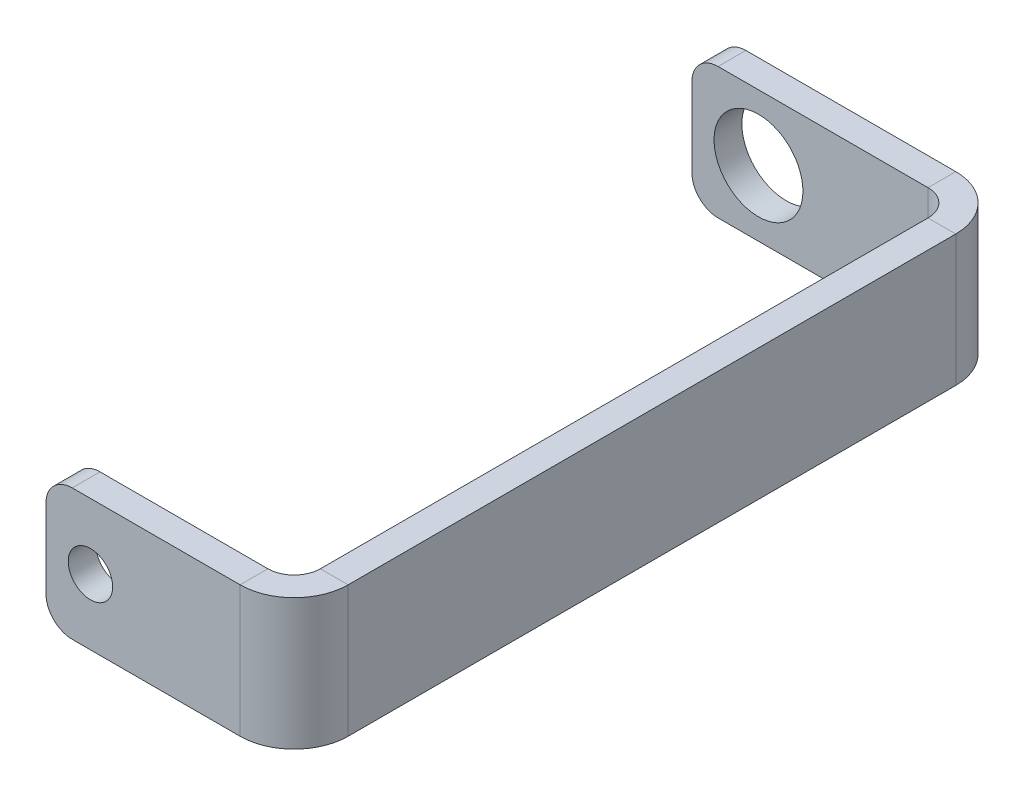
ISO-10303-21;
HEADER;
FILE_DESCRIPTION(('STEP AP214'),'2;1');
FILE_NAME('part.step','',(''),(''),'','','');
FILE_SCHEMA(('AUTOMOTIVE_DESIGN { 1 0 10303 214 1 1 1 1 }'));
ENDSEC;
DATA;
#1=APPLICATION_CONTEXT('core data for automotive mechanical design processes');
#2=APPLICATION_PROTOCOL_DEFINITION('international standard','automotive_design',2000,#1);
#3=PRODUCT_CONTEXT('',#1,'mechanical');
#4=PRODUCT('Part','Part','',(#3));
#5=PRODUCT_RELATED_PRODUCT_CATEGORY('part','',(#4));
#6=PRODUCT_DEFINITION_FORMATION('','',#4);
#7=PRODUCT_DEFINITION_CONTEXT('part definition',#1,'design');
#8=PRODUCT_DEFINITION('design','',#6,#7);
#9=PRODUCT_DEFINITION_SHAPE('','',#8);
#10=(LENGTH_UNIT() NAMED_UNIT(*) SI_UNIT(.MILLI.,.METRE.));
#11=(NAMED_UNIT(*) PLANE_ANGLE_UNIT() SI_UNIT($,.RADIAN.));
#12=(NAMED_UNIT(*) SI_UNIT($,.STERADIAN.) SOLID_ANGLE_UNIT());
#13=UNCERTAINTY_MEASURE_WITH_UNIT(LENGTH_MEASURE(1.E-05),#10,'distance_accuracy_value','');
#14=(GEOMETRIC_REPRESENTATION_CONTEXT(3) GLOBAL_UNCERTAINTY_ASSIGNED_CONTEXT((#13)) GLOBAL_UNIT_ASSIGNED_CONTEXT((#10,
#11,#12)) REPRESENTATION_CONTEXT('',''));
#15=CARTESIAN_POINT('',(0.,0.,0.));
#16=DIRECTION('',(0.,0.,1.));
#17=DIRECTION('',(1.,0.,0.));
#18=AXIS2_PLACEMENT_3D('',#15,#16,#17);
#19=CARTESIAN_POINT('',(18.175,7.5,0.));
#20=DIRECTION('',(0.,1.,0.));
#21=DIRECTION('',(0.,0.,1.));
#22=AXIS2_PLACEMENT_3D('',#19,#20,#21);
#23=PLANE('',#22);
#24=DIRECTION('',(0.,0.,-1.));
#25=VECTOR('',#24,1.);
#26=CARTESIAN_POINT('',(15.,7.5,0.));
#27=LINE('',#26,#25);
#28=CARTESIAN_POINT('',(15.0000000000003,7.5,72.477));
#29=VERTEX_POINT('',#28);
#30=CARTESIAN_POINT('',(15.,7.5,2.99999999999999));
#31=VERTEX_POINT('',#30);
#32=EDGE_CURVE('E236',#29,#31,#27,.T.);
#33=ORIENTED_EDGE('',*,*,#32,.F.);
#34=DIRECTION('',(1.,0.,0.));
#35=VECTOR('',#34,1.);
#36=CARTESIAN_POINT('',(15.0000000000003,7.5,72.477));
#37=LINE('',#36,#35);
#38=CARTESIAN_POINT('',(18.1750000000003,7.5,72.477));
#39=VERTEX_POINT('',#38);
#40=EDGE_CURVE('E208',#29,#39,#37,.T.);
#41=ORIENTED_EDGE('',*,*,#40,.T.);
#42=DIRECTION('',(0.,0.,-1.));
#43=VECTOR('',#42,1.);
#44=CARTESIAN_POINT('',(18.175,7.5,0.));
#45=LINE('',#44,#43);
#46=CARTESIAN_POINT('',(18.175,7.5,2.99999999999998));
#47=VERTEX_POINT('',#46);
#48=EDGE_CURVE('E235',#39,#47,#45,.T.);
#49=ORIENTED_EDGE('',*,*,#48,.T.);
#50=DIRECTION('',(1.,0.,0.));
#51=VECTOR('',#50,1.);
#52=CARTESIAN_POINT('',(15.,7.5,2.99999999999999));
#53=LINE('',#52,#51);
#54=EDGE_CURVE('E223',#31,#47,#53,.T.);
#55=ORIENTED_EDGE('',*,*,#54,.F.);
#56=EDGE_LOOP('',(#33,#41,#49,#55));
#57=FACE_BOUND('',#56,.T.);
#58=ADVANCED_FACE('F43',(#57),#23,.T.);
#59=CARTESIAN_POINT('',(18.175,0.,0.));
#60=DIRECTION('',(1.,0.,0.));
#61=DIRECTION('',(0.,0.,-1.));
#62=AXIS2_PLACEMENT_3D('',#59,#60,#61);
#63=PLANE('',#62);
#64=ORIENTED_EDGE('',*,*,#48,.F.);
#65=DIRECTION('',(0.,1.,0.));
#66=VECTOR('',#65,1.);
#67=CARTESIAN_POINT('',(18.1750000000003,7.5,72.477));
#68=LINE('',#67,#66);
#69=CARTESIAN_POINT('',(18.1750000000003,-7.5,72.477));
#70=VERTEX_POINT('',#69);
#71=EDGE_CURVE('E177',#39,#70,#68,.F.);
#72=ORIENTED_EDGE('',*,*,#71,.T.);
#73=DIRECTION('',(0.,0.,1.));
#74=VECTOR('',#73,1.);
#75=CARTESIAN_POINT('',(18.1750000000003,-7.5,75.477));
#76=LINE('',#75,#74);
#77=CARTESIAN_POINT('',(18.175,-7.5,2.99999999999998));
#78=VERTEX_POINT('',#77);
#79=EDGE_CURVE('E232',#78,#70,#76,.T.);
#80=ORIENTED_EDGE('',*,*,#79,.F.);
#81=DIRECTION('',(0.,1.,0.));
#82=VECTOR('',#81,1.);
#83=CARTESIAN_POINT('',(18.175,0.,2.99999999999998));
#84=LINE('',#83,#82);
#85=EDGE_CURVE('E226',#78,#47,#84,.T.);
#86=ORIENTED_EDGE('',*,*,#85,.T.);
#87=EDGE_LOOP('',(#64,#72,#80,#86));
#88=FACE_BOUND('',#87,.T.);
#89=ADVANCED_FACE('F350',(#88),#63,.T.);
#90=CARTESIAN_POINT('',(15.,0.,0.));
#91=DIRECTION('',(1.,0.,0.));
#92=DIRECTION('',(0.,0.,-1.));
#93=AXIS2_PLACEMENT_3D('',#90,#91,#92);
#94=PLANE('',#93);
#95=DIRECTION('',(0.,1.,0.));
#96=VECTOR('',#95,1.);
#97=CARTESIAN_POINT('',(15.0000000000003,7.5,72.477));
#98=LINE('',#97,#96);
#99=CARTESIAN_POINT('',(15.0000000000003,-7.5,72.477));
#100=VERTEX_POINT('',#99);
#101=EDGE_CURVE('E212',#29,#100,#98,.F.);
#102=ORIENTED_EDGE('',*,*,#101,.F.);
#103=ORIENTED_EDGE('',*,*,#32,.T.);
#104=DIRECTION('',(0.,1.,0.));
#105=VECTOR('',#104,1.);
#106=CARTESIAN_POINT('',(15.,-7.5,2.99999999999999));
#107=LINE('',#106,#105);
#108=CARTESIAN_POINT('',(15.,-7.5,2.99999999999999));
#109=VERTEX_POINT('',#108);
#110=EDGE_CURVE('E220',#109,#31,#107,.T.);
#111=ORIENTED_EDGE('',*,*,#110,.F.);
#112=DIRECTION('',(0.,0.,1.));
#113=VECTOR('',#112,1.);
#114=CARTESIAN_POINT('',(15.0000000000003,-7.5,75.477));
#115=LINE('',#114,#113);
#116=EDGE_CURVE('E231',#109,#100,#115,.T.);
#117=ORIENTED_EDGE('',*,*,#116,.T.);
#118=EDGE_LOOP('',(#102,#103,#111,#117));
#119=FACE_BOUND('',#118,.T.);
#120=ADVANCED_FACE('F360',(#119),#94,.F.);
#121=CARTESIAN_POINT('',(-15.,7.5,-3.175));
#122=DIRECTION('',(0.,1.,0.));
#123=DIRECTION('',(0.,0.,1.));
#124=AXIS2_PLACEMENT_3D('',#121,#122,#123);
#125=PLANE('',#124);
#126=DIRECTION('',(-1.,0.,0.));
#127=VECTOR('',#126,1.);
#128=CARTESIAN_POINT('',(-15.,7.5,-3.175));
#129=LINE('',#128,#127);
#130=CARTESIAN_POINT('',(12.,7.5,-3.175));
#131=VERTEX_POINT('',#130);
#132=CARTESIAN_POINT('',(-12.,7.5,-3.175));
#133=VERTEX_POINT('',#132);
#134=EDGE_CURVE('E266',#131,#133,#129,.T.);
#135=ORIENTED_EDGE('',*,*,#134,.T.);
#136=DIRECTION('',(0.,0.,1.));
#137=VECTOR('',#136,1.);
#138=CARTESIAN_POINT('',(-12.,7.5,-3.175));
#139=LINE('',#138,#137);
#140=CARTESIAN_POINT('',(-12.,7.5,0.));
#141=VERTEX_POINT('',#140);
#142=EDGE_CURVE('E302',#133,#141,#139,.T.);
#143=ORIENTED_EDGE('',*,*,#142,.T.);
#144=DIRECTION('',(-1.,0.,0.));
#145=VECTOR('',#144,1.);
#146=CARTESIAN_POINT('',(-15.,7.5,0.));
#147=LINE('',#146,#145);
#148=CARTESIAN_POINT('',(12.,7.5,0.));
#149=VERTEX_POINT('',#148);
#150=EDGE_CURVE('E263',#149,#141,#147,.T.);
#151=ORIENTED_EDGE('',*,*,#150,.F.);
#152=DIRECTION('',(0.,0.,-1.));
#153=VECTOR('',#152,1.);
#154=CARTESIAN_POINT('',(12.,7.5,0.));
#155=LINE('',#154,#153);
#156=EDGE_CURVE('E249',#149,#131,#155,.T.);
#157=ORIENTED_EDGE('',*,*,#156,.T.);
#158=EDGE_LOOP('',(#135,#143,#151,#157));
#159=FACE_BOUND('',#158,.T.);
#160=ADVANCED_FACE('F321',(#159),#125,.T.);
#161=CARTESIAN_POINT('',(0.,0.,-3.175));
#162=DIRECTION('',(0.,0.,-1.));
#163=DIRECTION('',(-1.,0.,0.));
#164=AXIS2_PLACEMENT_3D('',#161,#162,#163);
#165=PLANE('',#164);
#166=CARTESIAN_POINT('',(-7.38,0.,-3.175));
#167=DIRECTION('',(0.,0.,1.));
#168=DIRECTION('',(1.,0.,0.));
#169=AXIS2_PLACEMENT_3D('',#166,#167,#168);
#170=CIRCLE('',#169,5.08);
#171=CARTESIAN_POINT('',(-2.3,0.,-3.175));
#172=VERTEX_POINT('',#171);
#173=EDGE_CURVE('E370',#172,#172,#170,.T.);
#174=ORIENTED_EDGE('',*,*,#173,.T.);
#175=EDGE_LOOP('',(#174));
#176=FACE_BOUND('',#175,.T.);
#177=DIRECTION('',(0.,-1.,0.));
#178=VECTOR('',#177,1.);
#179=CARTESIAN_POINT('',(-15.,-7.5,-3.175));
#180=LINE('',#179,#178);
#181=CARTESIAN_POINT('',(-15.,4.5,-3.175));
#182=VERTEX_POINT('',#181);
#183=CARTESIAN_POINT('',(-15.,-4.5,-3.175));
#184=VERTEX_POINT('',#183);
#185=EDGE_CURVE('E269',#182,#184,#180,.T.);
#186=ORIENTED_EDGE('',*,*,#185,.F.);
#187=CARTESIAN_POINT('',(-12.,4.5,-3.175));
#188=DIRECTION('',(0.,0.,-1.));
#189=DIRECTION('',(-1.,0.,0.));
#190=AXIS2_PLACEMENT_3D('',#187,#188,#189);
#191=CIRCLE('',#190,3.);
#192=EDGE_CURVE('E51',#182,#133,#191,.T.);
#193=ORIENTED_EDGE('',*,*,#192,.T.);
#194=ORIENTED_EDGE('',*,*,#134,.F.);
#195=DIRECTION('',(0.,1.,0.));
#196=VECTOR('',#195,1.);
#197=CARTESIAN_POINT('',(12.,7.5,-3.175));
#198=LINE('',#197,#196);
#199=CARTESIAN_POINT('',(12.,-7.5,-3.175));
#200=VERTEX_POINT('',#199);
#201=EDGE_CURVE('E242',#131,#200,#198,.F.);
#202=ORIENTED_EDGE('',*,*,#201,.T.);
#203=DIRECTION('',(1.,0.,0.));
#204=VECTOR('',#203,1.);
#205=CARTESIAN_POINT('',(-15.,-7.5,-3.175));
#206=LINE('',#205,#204);
#207=CARTESIAN_POINT('',(-12.,-7.5,-3.175));
#208=VERTEX_POINT('',#207);
#209=EDGE_CURVE('E272',#208,#200,#206,.T.);
#210=ORIENTED_EDGE('',*,*,#209,.F.);
#211=CARTESIAN_POINT('',(-12.,-4.5,-3.175));
#212=DIRECTION('',(0.,0.,-1.));
#213=DIRECTION('',(-1.,0.,0.));
#214=AXIS2_PLACEMENT_3D('',#211,#212,#213);
#215=CIRCLE('',#214,3.);
#216=EDGE_CURVE('E63',#208,#184,#215,.T.);
#217=ORIENTED_EDGE('',*,*,#216,.T.);
#218=EDGE_LOOP('',(#186,#193,#194,#202,#210,#217));
#219=FACE_BOUND('',#218,.T.);
#220=ADVANCED_FACE('F316',(#176,#219),#165,.T.);
#221=CARTESIAN_POINT('',(0.,0.,0.));
#222=DIRECTION('',(0.,0.,-1.));
#223=DIRECTION('',(-1.,0.,0.));
#224=AXIS2_PLACEMENT_3D('',#221,#222,#223);
#225=PLANE('',#224);
#226=CARTESIAN_POINT('',(-7.38,0.,0.));
#227=DIRECTION('',(0.,0.,1.));
#228=DIRECTION('',(1.,0.,0.));
#229=AXIS2_PLACEMENT_3D('',#226,#227,#228);
#230=CIRCLE('',#229,5.08);
#231=CARTESIAN_POINT('',(-2.3,0.,0.));
#232=VERTEX_POINT('',#231);
#233=EDGE_CURVE('E284',#232,#232,#230,.T.);
#234=ORIENTED_EDGE('',*,*,#233,.F.);
#235=EDGE_LOOP('',(#234));
#236=FACE_BOUND('',#235,.T.);
#237=ORIENTED_EDGE('',*,*,#150,.T.);
#238=CARTESIAN_POINT('',(-12.,4.5,0.));
#239=DIRECTION('',(0.,0.,-1.));
#240=DIRECTION('',(-1.,0.,0.));
#241=AXIS2_PLACEMENT_3D('',#238,#239,#240);
#242=CIRCLE('',#241,3.);
#243=CARTESIAN_POINT('',(-15.,4.5,0.));
#244=VERTEX_POINT('',#243);
#245=EDGE_CURVE('E307',#141,#244,#242,.F.);
#246=ORIENTED_EDGE('',*,*,#245,.T.);
#247=DIRECTION('',(0.,-1.,0.));
#248=VECTOR('',#247,1.);
#249=CARTESIAN_POINT('',(-15.,-7.5,0.));
#250=LINE('',#249,#248);
#251=CARTESIAN_POINT('',(-15.,-4.5,0.));
#252=VERTEX_POINT('',#251);
#253=EDGE_CURVE('E277',#244,#252,#250,.T.);
#254=ORIENTED_EDGE('',*,*,#253,.T.);
#255=CARTESIAN_POINT('',(-12.,-4.5,0.));
#256=DIRECTION('',(0.,0.,-1.));
#257=DIRECTION('',(-1.,0.,0.));
#258=AXIS2_PLACEMENT_3D('',#255,#256,#257);
#259=CIRCLE('',#258,3.);
#260=CARTESIAN_POINT('',(-12.,-7.5,0.));
#261=VERTEX_POINT('',#260);
#262=EDGE_CURVE('E305',#252,#261,#259,.F.);
#263=ORIENTED_EDGE('',*,*,#262,.T.);
#264=DIRECTION('',(1.,0.,0.));
#265=VECTOR('',#264,1.);
#266=CARTESIAN_POINT('',(-15.,-7.5,0.));
#267=LINE('',#266,#265);
#268=CARTESIAN_POINT('',(12.,-7.5,0.));
#269=VERTEX_POINT('',#268);
#270=EDGE_CURVE('E270',#261,#269,#267,.T.);
#271=ORIENTED_EDGE('',*,*,#270,.T.);
#272=DIRECTION('',(0.,1.,0.));
#273=VECTOR('',#272,1.);
#274=CARTESIAN_POINT('',(12.,7.5,0.));
#275=LINE('',#274,#273);
#276=EDGE_CURVE('E255',#149,#269,#275,.F.);
#277=ORIENTED_EDGE('',*,*,#276,.F.);
#278=EDGE_LOOP('',(#237,#246,#254,#263,#271,#277));
#279=FACE_BOUND('',#278,.T.);
#280=ADVANCED_FACE('F326',(#236,#279),#225,.F.);
#281=CARTESIAN_POINT('',(-15.,-7.5,-3.175));
#282=DIRECTION('',(0.,-1.,0.));
#283=DIRECTION('',(0.,0.,-1.));
#284=AXIS2_PLACEMENT_3D('',#281,#282,#283);
#285=PLANE('',#284);
#286=ORIENTED_EDGE('',*,*,#270,.F.);
#287=DIRECTION('',(0.,0.,1.));
#288=VECTOR('',#287,1.);
#289=CARTESIAN_POINT('',(-12.,-7.5,-3.175));
#290=LINE('',#289,#288);
#291=EDGE_CURVE('E11',#261,#208,#290,.F.);
#292=ORIENTED_EDGE('',*,*,#291,.T.);
#293=ORIENTED_EDGE('',*,*,#209,.T.);
#294=DIRECTION('',(0.,0.,-1.));
#295=VECTOR('',#294,1.);
#296=CARTESIAN_POINT('',(12.,-7.5,0.));
#297=LINE('',#296,#295);
#298=EDGE_CURVE('E260',#269,#200,#297,.T.);
#299=ORIENTED_EDGE('',*,*,#298,.F.);
#300=EDGE_LOOP('',(#286,#292,#293,#299));
#301=FACE_BOUND('',#300,.T.);
#302=ADVANCED_FACE('F333',(#301),#285,.T.);
#303=CARTESIAN_POINT('',(-15.,-7.5,-3.175));
#304=DIRECTION('',(-1.,0.,0.));
#305=DIRECTION('',(0.,0.,1.));
#306=AXIS2_PLACEMENT_3D('',#303,#304,#305);
#307=PLANE('',#306);
#308=ORIENTED_EDGE('',*,*,#253,.F.);
#309=DIRECTION('',(0.,0.,1.));
#310=VECTOR('',#309,1.);
#311=CARTESIAN_POINT('',(-15.,4.5,-3.175));
#312=LINE('',#311,#310);
#313=EDGE_CURVE('E312',#244,#182,#312,.F.);
#314=ORIENTED_EDGE('',*,*,#313,.T.);
#315=ORIENTED_EDGE('',*,*,#185,.T.);
#316=DIRECTION('',(0.,0.,1.));
#317=VECTOR('',#316,1.);
#318=CARTESIAN_POINT('',(-15.,-4.5,-3.175));
#319=LINE('',#318,#317);
#320=EDGE_CURVE('E309',#184,#252,#319,.T.);
#321=ORIENTED_EDGE('',*,*,#320,.T.);
#322=EDGE_LOOP('',(#308,#314,#315,#321));
#323=FACE_BOUND('',#322,.T.);
#324=ADVANCED_FACE('F329',(#323),#307,.T.);
#325=CARTESIAN_POINT('',(12.,-7.5,3.));
#326=DIRECTION('',(0.,-1.,0.));
#327=DIRECTION('',(0.,0.,-1.));
#328=AXIS2_PLACEMENT_3D('',#325,#326,#327);
#329=PLANE('',#328);
#330=DIRECTION('',(1.,0.,0.));
#331=VECTOR('',#330,1.);
#332=CARTESIAN_POINT('',(15.,-7.5,2.99999999999999));
#333=LINE('',#332,#331);
#334=EDGE_CURVE('E218',#109,#78,#333,.T.);
#335=ORIENTED_EDGE('',*,*,#334,.F.);
#336=CARTESIAN_POINT('',(12.,-7.5,3.));
#337=DIRECTION('',(0.,1.,0.));
#338=DIRECTION('',(0.,0.,1.));
#339=AXIS2_PLACEMENT_3D('',#336,#337,#338);
#340=CIRCLE('',#339,3.);
#341=EDGE_CURVE('E252',#269,#109,#340,.F.);
#342=ORIENTED_EDGE('',*,*,#341,.F.);
#343=ORIENTED_EDGE('',*,*,#298,.T.);
#344=CARTESIAN_POINT('',(12.,-7.5,3.));
#345=DIRECTION('',(0.,1.,0.));
#346=DIRECTION('',(0.,0.,1.));
#347=AXIS2_PLACEMENT_3D('',#344,#345,#346);
#348=CIRCLE('',#347,6.175);
#349=EDGE_CURVE('E245',#200,#78,#348,.F.);
#350=ORIENTED_EDGE('',*,*,#349,.T.);
#351=EDGE_LOOP('',(#335,#342,#343,#350));
#352=FACE_BOUND('',#351,.T.);
#353=ADVANCED_FACE('F337',(#352),#329,.T.);
#354=CARTESIAN_POINT('',(12.,7.5,3.));
#355=DIRECTION('',(0.,-1.,0.));
#356=DIRECTION('',(0.,0.,-1.));
#357=AXIS2_PLACEMENT_3D('',#354,#355,#356);
#358=PLANE('',#357);
#359=CARTESIAN_POINT('',(12.,7.5,3.));
#360=DIRECTION('',(0.,1.,0.));
#361=DIRECTION('',(0.,0.,1.));
#362=AXIS2_PLACEMENT_3D('',#359,#360,#361);
#363=CIRCLE('',#362,3.);
#364=EDGE_CURVE('E238',#31,#149,#363,.T.);
#365=ORIENTED_EDGE('',*,*,#364,.F.);
#366=ORIENTED_EDGE('',*,*,#54,.T.);
#367=CARTESIAN_POINT('',(12.,7.5,3.));
#368=DIRECTION('',(0.,1.,0.));
#369=DIRECTION('',(0.,0.,1.));
#370=AXIS2_PLACEMENT_3D('',#367,#368,#369);
#371=CIRCLE('',#370,6.175);
#372=EDGE_CURVE('E246',#47,#131,#371,.T.);
#373=ORIENTED_EDGE('',*,*,#372,.T.);
#374=ORIENTED_EDGE('',*,*,#156,.F.);
#375=EDGE_LOOP('',(#365,#366,#373,#374));
#376=FACE_BOUND('',#375,.T.);
#377=ADVANCED_FACE('F343',(#376),#358,.F.);
#378=CARTESIAN_POINT('',(12.,7.5,3.));
#379=DIRECTION('',(0.,1.,0.));
#380=DIRECTION('',(1.,0.,0.));
#381=AXIS2_PLACEMENT_3D('',#378,#379,#380);
#382=CYLINDRICAL_SURFACE('',#381,6.175);
#383=ORIENTED_EDGE('',*,*,#201,.F.);
#384=ORIENTED_EDGE('',*,*,#372,.F.);
#385=ORIENTED_EDGE('',*,*,#85,.F.);
#386=ORIENTED_EDGE('',*,*,#349,.F.);
#387=EDGE_LOOP('',(#383,#384,#385,#386));
#388=FACE_BOUND('',#387,.T.);
#389=ADVANCED_FACE('F340',(#388),#382,.T.);
#390=CARTESIAN_POINT('',(12.,7.5,3.));
#391=DIRECTION('',(0.,1.,0.));
#392=DIRECTION('',(1.,0.,0.));
#393=AXIS2_PLACEMENT_3D('',#390,#391,#392);
#394=CYLINDRICAL_SURFACE('',#393,3.);
#395=ORIENTED_EDGE('',*,*,#276,.T.);
#396=ORIENTED_EDGE('',*,*,#341,.T.);
#397=ORIENTED_EDGE('',*,*,#110,.T.);
#398=ORIENTED_EDGE('',*,*,#364,.T.);
#399=EDGE_LOOP('',(#395,#396,#397,#398));
#400=FACE_BOUND('',#399,.T.);
#401=ADVANCED_FACE('F357',(#400),#394,.F.);
#402=CARTESIAN_POINT('',(18.1750000000003,-7.5,75.477));
#403=DIRECTION('',(0.,-1.,0.));
#404=DIRECTION('',(0.,0.,-1.));
#405=AXIS2_PLACEMENT_3D('',#402,#403,#404);
#406=PLANE('',#405);
#407=DIRECTION('',(1.,0.,0.));
#408=VECTOR('',#407,1.);
#409=CARTESIAN_POINT('',(15.0000000000003,-7.5,72.477));
#410=LINE('',#409,#408);
#411=EDGE_CURVE('E215',#100,#70,#410,.T.);
#412=ORIENTED_EDGE('',*,*,#411,.F.);
#413=ORIENTED_EDGE('',*,*,#116,.F.);
#414=ORIENTED_EDGE('',*,*,#334,.T.);
#415=ORIENTED_EDGE('',*,*,#79,.T.);
#416=EDGE_LOOP('',(#412,#413,#414,#415));
#417=FACE_BOUND('',#416,.T.);
#418=ADVANCED_FACE('F353',(#417),#406,.T.);
#419=CARTESIAN_POINT('',(12.0000000000003,-7.5,72.477));
#420=DIRECTION('',(0.,-1.,0.));
#421=DIRECTION('',(0.,0.,-1.));
#422=AXIS2_PLACEMENT_3D('',#419,#420,#421);
#423=PLANE('',#422);
#424=DIRECTION('',(0.,0.,1.));
#425=VECTOR('',#424,1.);
#426=CARTESIAN_POINT('',(12.0000000000003,-7.5,75.477));
#427=LINE('',#426,#425);
#428=CARTESIAN_POINT('',(12.0000000000003,-7.5,75.477));
#429=VERTEX_POINT('',#428);
#430=CARTESIAN_POINT('',(12.0000000000003,-7.49999999999999,78.652));
#431=VERTEX_POINT('',#430);
#432=EDGE_CURVE('E198',#429,#431,#427,.T.);
#433=ORIENTED_EDGE('',*,*,#432,.F.);
#434=CARTESIAN_POINT('',(12.0000000000003,-7.5,72.477));
#435=DIRECTION('',(0.,1.,0.));
#436=DIRECTION('',(0.,0.,1.));
#437=AXIS2_PLACEMENT_3D('',#434,#435,#436);
#438=CIRCLE('',#437,3.);
#439=EDGE_CURVE('E180',#100,#429,#438,.F.);
#440=ORIENTED_EDGE('',*,*,#439,.F.);
#441=ORIENTED_EDGE('',*,*,#411,.T.);
#442=CARTESIAN_POINT('',(12.0000000000003,-7.49999999999999,72.477));
#443=DIRECTION('',(0.,1.,0.));
#444=DIRECTION('',(0.,0.,1.));
#445=AXIS2_PLACEMENT_3D('',#442,#443,#444);
#446=CIRCLE('',#445,6.175);
#447=EDGE_CURVE('E207',#70,#431,#446,.F.);
#448=ORIENTED_EDGE('',*,*,#447,.T.);
#449=EDGE_LOOP('',(#433,#440,#441,#448));
#450=FACE_BOUND('',#449,.T.);
#451=ADVANCED_FACE('F406',(#450),#423,.T.);
#452=CARTESIAN_POINT('',(12.0000000000003,7.5,72.477));
#453=DIRECTION('',(0.,-1.,0.));
#454=DIRECTION('',(0.,0.,-1.));
#455=AXIS2_PLACEMENT_3D('',#452,#453,#454);
#456=PLANE('',#455);
#457=CARTESIAN_POINT('',(12.0000000000003,7.5,72.477));
#458=DIRECTION('',(0.,1.,0.));
#459=DIRECTION('',(0.,0.,1.));
#460=AXIS2_PLACEMENT_3D('',#457,#458,#459);
#461=CIRCLE('',#460,3.);
#462=CARTESIAN_POINT('',(12.0000000000003,7.5,75.477));
#463=VERTEX_POINT('',#462);
#464=EDGE_CURVE('E167',#463,#29,#461,.T.);
#465=ORIENTED_EDGE('',*,*,#464,.F.);
#466=DIRECTION('',(0.,0.,1.));
#467=VECTOR('',#466,1.);
#468=CARTESIAN_POINT('',(12.0000000000003,7.5,75.477));
#469=LINE('',#468,#467);
#470=CARTESIAN_POINT('',(12.0000000000003,7.5,78.652));
#471=VERTEX_POINT('',#470);
#472=EDGE_CURVE('E161',#463,#471,#469,.T.);
#473=ORIENTED_EDGE('',*,*,#472,.T.);
#474=CARTESIAN_POINT('',(12.0000000000003,7.5,72.477));
#475=DIRECTION('',(0.,1.,0.));
#476=DIRECTION('',(0.,0.,1.));
#477=AXIS2_PLACEMENT_3D('',#474,#475,#476);
#478=CIRCLE('',#477,6.175);
#479=EDGE_CURVE('E172',#471,#39,#478,.T.);
#480=ORIENTED_EDGE('',*,*,#479,.T.);
#481=ORIENTED_EDGE('',*,*,#40,.F.);
#482=EDGE_LOOP('',(#465,#473,#480,#481));
#483=FACE_BOUND('',#482,.T.);
#484=ADVANCED_FACE('F183',(#483),#456,.F.);
#485=CARTESIAN_POINT('',(12.0000000000003,7.5,72.477));
#486=DIRECTION('',(0.,1.,0.));
#487=DIRECTION('',(0.,0.,1.));
#488=AXIS2_PLACEMENT_3D('',#485,#486,#487);
#489=CYLINDRICAL_SURFACE('',#488,6.175);
#490=ORIENTED_EDGE('',*,*,#71,.F.);
#491=ORIENTED_EDGE('',*,*,#479,.F.);
#492=DIRECTION('',(0.,1.,0.));
#493=VECTOR('',#492,1.);
#494=CARTESIAN_POINT('',(12.0000000000003,0.,78.652));
#495=LINE('',#494,#493);
#496=EDGE_CURVE('E174',#431,#471,#495,.T.);
#497=ORIENTED_EDGE('',*,*,#496,.F.);
#498=ORIENTED_EDGE('',*,*,#447,.F.);
#499=EDGE_LOOP('',(#490,#491,#497,#498));
#500=FACE_BOUND('',#499,.T.);
#501=ADVANCED_FACE('F173',(#500),#489,.T.);
#502=CARTESIAN_POINT('',(12.0000000000003,7.5,72.477));
#503=DIRECTION('',(0.,1.,0.));
#504=DIRECTION('',(0.,0.,1.));
#505=AXIS2_PLACEMENT_3D('',#502,#503,#504);
#506=CYLINDRICAL_SURFACE('',#505,3.);
#507=ORIENTED_EDGE('',*,*,#101,.T.);
#508=ORIENTED_EDGE('',*,*,#439,.T.);
#509=DIRECTION('',(0.,1.,0.));
#510=VECTOR('',#509,1.);
#511=CARTESIAN_POINT('',(12.0000000000003,-7.5,75.477));
#512=LINE('',#511,#510);
#513=EDGE_CURVE('E185',#429,#463,#512,.T.);
#514=ORIENTED_EDGE('',*,*,#513,.T.);
#515=ORIENTED_EDGE('',*,*,#464,.T.);
#516=EDGE_LOOP('',(#507,#508,#514,#515));
#517=FACE_BOUND('',#516,.T.);
#518=ADVANCED_FACE('F363',(#517),#506,.F.);
#519=CARTESIAN_POINT('',(15.0000000000003,7.5,78.652));
#520=DIRECTION('',(0.,1.,0.));
#521=DIRECTION('',(0.,0.,1.));
#522=AXIS2_PLACEMENT_3D('',#519,#520,#521);
#523=PLANE('',#522);
#524=DIRECTION('',(1.,0.,0.));
#525=VECTOR('',#524,1.);
#526=CARTESIAN_POINT('',(15.0000000000003,7.5,75.477));
#527=LINE('',#526,#525);
#528=CARTESIAN_POINT('',(-7.19499999999975,7.5,75.4770000000002));
#529=VERTEX_POINT('',#528);
#530=EDGE_CURVE('E200',#529,#463,#527,.T.);
#531=ORIENTED_EDGE('',*,*,#530,.F.);
#532=DIRECTION('',(0.,0.,-1.));
#533=VECTOR('',#532,1.);
#534=CARTESIAN_POINT('',(-7.19499999999973,7.5,78.6520000000002));
#535=LINE('',#534,#533);
#536=CARTESIAN_POINT('',(-7.19499999999973,7.5,78.6520000000002));
#537=VERTEX_POINT('',#536);
#538=EDGE_CURVE('E163',#529,#537,#535,.F.);
#539=ORIENTED_EDGE('',*,*,#538,.T.);
#540=DIRECTION('',(1.,0.,0.));
#541=VECTOR('',#540,1.);
#542=CARTESIAN_POINT('',(15.0000000000003,7.5,78.652));
#543=LINE('',#542,#541);
#544=EDGE_CURVE('E156',#537,#471,#543,.T.);
#545=ORIENTED_EDGE('',*,*,#544,.T.);
#546=ORIENTED_EDGE('',*,*,#472,.F.);
#547=EDGE_LOOP('',(#531,#539,#545,#546));
#548=FACE_BOUND('',#547,.T.);
#549=ADVANCED_FACE('F159',(#548),#523,.T.);
#550=CARTESIAN_POINT('',(-10.1949999999997,-7.5,78.6520000000002));
#551=DIRECTION('',(0.,-1.,0.));
#552=DIRECTION('',(0.,0.,-1.));
#553=AXIS2_PLACEMENT_3D('',#550,#551,#552);
#554=PLANE('',#553);
#555=DIRECTION('',(-1.,0.,0.));
#556=VECTOR('',#555,1.);
#557=CARTESIAN_POINT('',(-10.1949999999997,-7.5,78.6520000000002));
#558=LINE('',#557,#556);
#559=CARTESIAN_POINT('',(-7.19499999999973,-7.5,78.6520000000002));
#560=VERTEX_POINT('',#559);
#561=EDGE_CURVE('E190',#431,#560,#558,.T.);
#562=ORIENTED_EDGE('',*,*,#561,.T.);
#563=DIRECTION('',(0.,0.,-1.));
#564=VECTOR('',#563,1.);
#565=CARTESIAN_POINT('',(-7.19499999999973,-7.5,78.6520000000002));
#566=LINE('',#565,#564);
#567=CARTESIAN_POINT('',(-7.19499999999975,-7.5,75.4770000000002));
#568=VERTEX_POINT('',#567);
#569=EDGE_CURVE('E299',#560,#568,#566,.T.);
#570=ORIENTED_EDGE('',*,*,#569,.T.);
#571=DIRECTION('',(-1.,0.,0.));
#572=VECTOR('',#571,1.);
#573=CARTESIAN_POINT('',(-10.1949999999998,-7.5,75.4770000000002));
#574=LINE('',#573,#572);
#575=EDGE_CURVE('E191',#429,#568,#574,.T.);
#576=ORIENTED_EDGE('',*,*,#575,.F.);
#577=ORIENTED_EDGE('',*,*,#432,.T.);
#578=EDGE_LOOP('',(#562,#570,#576,#577));
#579=FACE_BOUND('',#578,.T.);
#580=ADVANCED_FACE('F384',(#579),#554,.T.);
#581=CARTESIAN_POINT('',(5.62637656609591E-13,0.,78.6520000000001));
#582=DIRECTION('',(0.,0.,1.));
#583=DIRECTION('',(1.,0.,0.));
#584=AXIS2_PLACEMENT_3D('',#581,#582,#583);
#585=PLANE('',#584);
#586=CARTESIAN_POINT('',(-5.11499999999973,0.,78.6520000000001));
#587=DIRECTION('',(0.,0.,1.));
#588=DIRECTION('',(1.,0.,0.));
#589=AXIS2_PLACEMENT_3D('',#586,#587,#588);
#590=CIRCLE('',#589,2.54);
#591=CARTESIAN_POINT('',(-2.57499999999973,0.,78.6520000000001));
#592=VERTEX_POINT('',#591);
#593=EDGE_CURVE('E285',#592,#592,#590,.T.);
#594=ORIENTED_EDGE('',*,*,#593,.F.);
#595=EDGE_LOOP('',(#594));
#596=FACE_BOUND('',#595,.T.);
#597=ORIENTED_EDGE('',*,*,#544,.F.);
#598=CARTESIAN_POINT('',(-7.19499999999973,4.5,78.6520000000002));
#599=DIRECTION('',(0.,0.,1.));
#600=DIRECTION('',(1.,0.,0.));
#601=AXIS2_PLACEMENT_3D('',#598,#599,#600);
#602=CIRCLE('',#601,3.);
#603=CARTESIAN_POINT('',(-10.1949999999997,4.5,78.6520000000002));
#604=VERTEX_POINT('',#603);
#605=EDGE_CURVE('E297',#537,#604,#602,.T.);
#606=ORIENTED_EDGE('',*,*,#605,.T.);
#607=DIRECTION('',(0.,1.,0.));
#608=VECTOR('',#607,1.);
#609=CARTESIAN_POINT('',(-10.1949999999997,7.5,78.6520000000002));
#610=LINE('',#609,#608);
#611=CARTESIAN_POINT('',(-10.1949999999997,-4.5,78.6520000000002));
#612=VERTEX_POINT('',#611);
#613=EDGE_CURVE('E168',#612,#604,#610,.T.);
#614=ORIENTED_EDGE('',*,*,#613,.F.);
#615=CARTESIAN_POINT('',(-7.19499999999973,-4.5,78.6520000000002));
#616=DIRECTION('',(0.,0.,1.));
#617=DIRECTION('',(1.,0.,0.));
#618=AXIS2_PLACEMENT_3D('',#615,#616,#617);
#619=CIRCLE('',#618,3.);
#620=EDGE_CURVE('E295',#612,#560,#619,.T.);
#621=ORIENTED_EDGE('',*,*,#620,.T.);
#622=ORIENTED_EDGE('',*,*,#561,.F.);
#623=ORIENTED_EDGE('',*,*,#496,.T.);
#624=EDGE_LOOP('',(#597,#606,#614,#621,#622,#623));
#625=FACE_BOUND('',#624,.T.);
#626=ADVANCED_FACE('F188',(#596,#625),#585,.T.);
#627=CARTESIAN_POINT('',(5.40460380028393E-13,0.,75.4770000000001));
#628=DIRECTION('',(0.,0.,1.));
#629=DIRECTION('',(1.,0.,0.));
#630=AXIS2_PLACEMENT_3D('',#627,#628,#629);
#631=PLANE('',#630);
#632=CARTESIAN_POINT('',(-5.11499999999973,0.,75.4770000000002));
#633=DIRECTION('',(0.,0.,1.));
#634=DIRECTION('',(1.,0.,0.));
#635=AXIS2_PLACEMENT_3D('',#632,#633,#634);
#636=CIRCLE('',#635,2.54);
#637=CARTESIAN_POINT('',(-2.57499999999973,0.,75.4770000000002));
#638=VERTEX_POINT('',#637);
#639=EDGE_CURVE('E281',#638,#638,#636,.T.);
#640=ORIENTED_EDGE('',*,*,#639,.T.);
#641=EDGE_LOOP('',(#640));
#642=FACE_BOUND('',#641,.T.);
#643=DIRECTION('',(0.,1.,0.));
#644=VECTOR('',#643,1.);
#645=CARTESIAN_POINT('',(-10.1949999999998,7.5,75.4770000000002));
#646=LINE('',#645,#644);
#647=CARTESIAN_POINT('',(-10.1949999999998,-4.5,75.4770000000002));
#648=VERTEX_POINT('',#647);
#649=CARTESIAN_POINT('',(-10.1949999999998,4.5,75.4770000000002));
#650=VERTEX_POINT('',#649);
#651=EDGE_CURVE('E194',#648,#650,#646,.T.);
#652=ORIENTED_EDGE('',*,*,#651,.T.);
#653=CARTESIAN_POINT('',(-7.19499999999975,4.5,75.4770000000002));
#654=DIRECTION('',(0.,0.,1.));
#655=DIRECTION('',(1.,0.,0.));
#656=AXIS2_PLACEMENT_3D('',#653,#654,#655);
#657=CIRCLE('',#656,3.);
#658=EDGE_CURVE('E292',#650,#529,#657,.F.);
#659=ORIENTED_EDGE('',*,*,#658,.T.);
#660=ORIENTED_EDGE('',*,*,#530,.T.);
#661=ORIENTED_EDGE('',*,*,#513,.F.);
#662=ORIENTED_EDGE('',*,*,#575,.T.);
#663=CARTESIAN_POINT('',(-7.19499999999975,-4.5,75.4770000000002));
#664=DIRECTION('',(0.,0.,1.));
#665=DIRECTION('',(1.,0.,0.));
#666=AXIS2_PLACEMENT_3D('',#663,#664,#665);
#667=CIRCLE('',#666,3.);
#668=EDGE_CURVE('E290',#568,#648,#667,.F.);
#669=ORIENTED_EDGE('',*,*,#668,.T.);
#670=EDGE_LOOP('',(#652,#659,#660,#661,#662,#669));
#671=FACE_BOUND('',#670,.T.);
#672=ADVANCED_FACE('F383',(#642,#671),#631,.F.);
#673=CARTESIAN_POINT('',(-10.1949999999997,7.5,78.6520000000002));
#674=DIRECTION('',(-1.,0.,0.));
#675=DIRECTION('',(0.,0.,1.));
#676=AXIS2_PLACEMENT_3D('',#673,#674,#675);
#677=PLANE('',#676);
#678=ORIENTED_EDGE('',*,*,#613,.T.);
#679=DIRECTION('',(0.,0.,-1.));
#680=VECTOR('',#679,1.);
#681=CARTESIAN_POINT('',(-10.1949999999997,4.5,78.6520000000002));
#682=LINE('',#681,#680);
#683=EDGE_CURVE('E287',#604,#650,#682,.T.);
#684=ORIENTED_EDGE('',*,*,#683,.T.);
#685=ORIENTED_EDGE('',*,*,#651,.F.);
#686=DIRECTION('',(0.,0.,-1.));
#687=VECTOR('',#686,1.);
#688=CARTESIAN_POINT('',(-10.1949999999997,-4.5,78.6520000000002));
#689=LINE('',#688,#687);
#690=EDGE_CURVE('E274',#648,#612,#689,.F.);
#691=ORIENTED_EDGE('',*,*,#690,.T.);
#692=EDGE_LOOP('',(#678,#684,#685,#691));
#693=FACE_BOUND('',#692,.T.);
#694=ADVANCED_FACE('F390',(#693),#677,.T.);
#695=CARTESIAN_POINT('',(-7.38,0.,-3.175));
#696=DIRECTION('',(0.,0.,1.));
#697=DIRECTION('',(1.,0.,0.));
#698=AXIS2_PLACEMENT_3D('',#695,#696,#697);
#699=CYLINDRICAL_SURFACE('',#698,5.08);
#700=ORIENTED_EDGE('',*,*,#173,.F.);
#701=EDGE_LOOP('',(#700));
#702=FACE_BOUND('',#701,.T.);
#703=ORIENTED_EDGE('',*,*,#233,.T.);
#704=EDGE_LOOP('',(#703));
#705=FACE_BOUND('',#704,.T.);
#706=ADVANCED_FACE('F471',(#702,#705),#699,.F.);
#707=CARTESIAN_POINT('',(-5.11499999999973,0.,68.6520000000001));
#708=DIRECTION('',(0.,0.,1.));
#709=DIRECTION('',(1.,0.,0.));
#710=AXIS2_PLACEMENT_3D('',#707,#708,#709);
#711=CYLINDRICAL_SURFACE('',#710,2.54);
#712=ORIENTED_EDGE('',*,*,#593,.T.);
#713=EDGE_LOOP('',(#712));
#714=FACE_BOUND('',#713,.T.);
#715=ORIENTED_EDGE('',*,*,#639,.F.);
#716=EDGE_LOOP('',(#715));
#717=FACE_BOUND('',#716,.T.);
#718=ADVANCED_FACE('F379',(#714,#717),#711,.F.);
#719=CARTESIAN_POINT('',(-7.19499999999973,4.5,78.6520000000002));
#720=DIRECTION('',(0.,0.,-1.));
#721=DIRECTION('',(-1.,0.,0.));
#722=AXIS2_PLACEMENT_3D('',#719,#720,#721);
#723=CYLINDRICAL_SURFACE('',#722,3.);
#724=ORIENTED_EDGE('',*,*,#605,.F.);
#725=ORIENTED_EDGE('',*,*,#538,.F.);
#726=ORIENTED_EDGE('',*,*,#658,.F.);
#727=ORIENTED_EDGE('',*,*,#683,.F.);
#728=EDGE_LOOP('',(#724,#725,#726,#727));
#729=FACE_BOUND('',#728,.T.);
#730=ADVANCED_FACE('F427',(#729),#723,.T.);
#731=CARTESIAN_POINT('',(-7.19499999999973,-4.5,78.6520000000002));
#732=DIRECTION('',(0.,0.,-1.));
#733=DIRECTION('',(-1.,0.,0.));
#734=AXIS2_PLACEMENT_3D('',#731,#732,#733);
#735=CYLINDRICAL_SURFACE('',#734,3.);
#736=ORIENTED_EDGE('',*,*,#620,.F.);
#737=ORIENTED_EDGE('',*,*,#690,.F.);
#738=ORIENTED_EDGE('',*,*,#668,.F.);
#739=ORIENTED_EDGE('',*,*,#569,.F.);
#740=EDGE_LOOP('',(#736,#737,#738,#739));
#741=FACE_BOUND('',#740,.T.);
#742=ADVANCED_FACE('F430',(#741),#735,.T.);
#743=CARTESIAN_POINT('',(-12.,4.5,-3.175));
#744=DIRECTION('',(0.,0.,1.));
#745=DIRECTION('',(1.,0.,0.));
#746=AXIS2_PLACEMENT_3D('',#743,#744,#745);
#747=CYLINDRICAL_SURFACE('',#746,3.);
#748=ORIENTED_EDGE('',*,*,#192,.F.);
#749=ORIENTED_EDGE('',*,*,#313,.F.);
#750=ORIENTED_EDGE('',*,*,#245,.F.);
#751=ORIENTED_EDGE('',*,*,#142,.F.);
#752=EDGE_LOOP('',(#748,#749,#750,#751));
#753=FACE_BOUND('',#752,.T.);
#754=ADVANCED_FACE('F323',(#753),#747,.T.);
#755=CARTESIAN_POINT('',(-12.,-4.5,-3.175));
#756=DIRECTION('',(0.,0.,1.));
#757=DIRECTION('',(1.,0.,0.));
#758=AXIS2_PLACEMENT_3D('',#755,#756,#757);
#759=CYLINDRICAL_SURFACE('',#758,3.);
#760=ORIENTED_EDGE('',*,*,#216,.F.);
#761=ORIENTED_EDGE('',*,*,#291,.F.);
#762=ORIENTED_EDGE('',*,*,#262,.F.);
#763=ORIENTED_EDGE('',*,*,#320,.F.);
#764=EDGE_LOOP('',(#760,#761,#762,#763));
#765=FACE_BOUND('',#764,.T.);
#766=ADVANCED_FACE('F45',(#765),#759,.T.);
#767=CLOSED_SHELL('',(#58,#89,#120,#160,#220,#280,#302,#324,#353,#377,#389,#401,#418,#451,#484,
#501,#518,#549,#580,#626,#672,#694,#706,#718,#730,#742,#754,#766));
#768=MANIFOLD_SOLID_BREP('B2',#767);
#769=ADVANCED_BREP_SHAPE_REPRESENTATION('',(#18,#768),#14);
#770=SHAPE_DEFINITION_REPRESENTATION(#9,#769);
ENDSEC;
END-ISO-10303-21;
